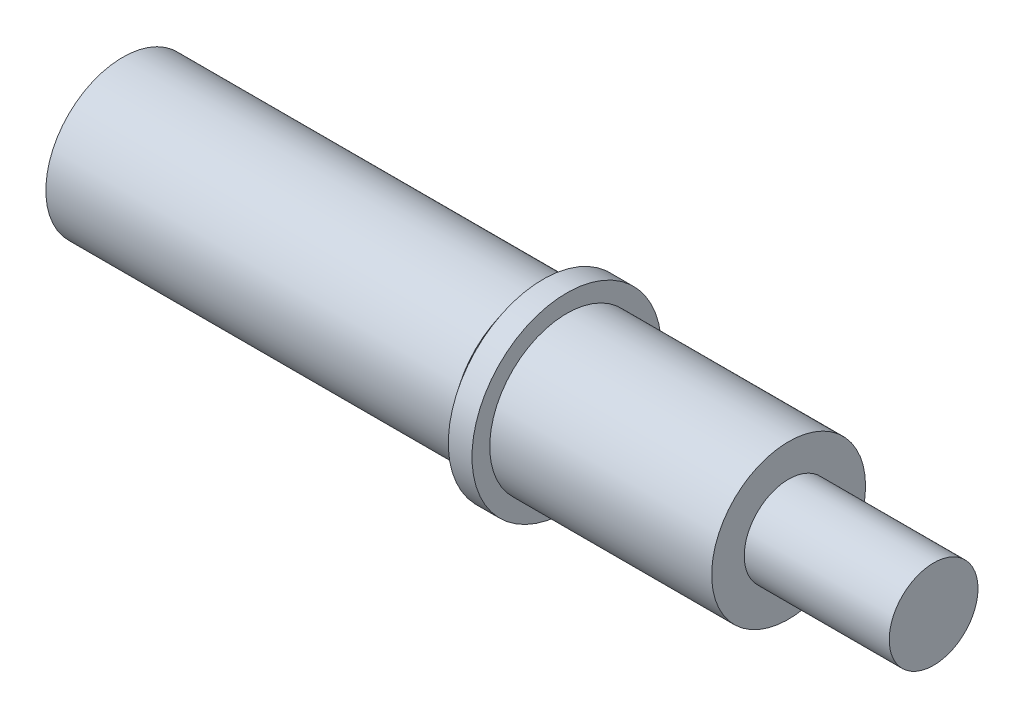
ISO-10303-21;
HEADER;
FILE_DESCRIPTION(('STEP AP214'),'2;1');
FILE_NAME('part.step','',(''),(''),'','','');
FILE_SCHEMA(('AUTOMOTIVE_DESIGN { 1 0 10303 214 1 1 1 1 }'));
ENDSEC;
DATA;
#1=APPLICATION_CONTEXT('core data for automotive mechanical design processes');
#2=APPLICATION_PROTOCOL_DEFINITION('international standard','automotive_design',2000,#1);
#3=PRODUCT_CONTEXT('',#1,'mechanical');
#4=PRODUCT('Part','Part','',(#3));
#5=PRODUCT_RELATED_PRODUCT_CATEGORY('part','',(#4));
#6=PRODUCT_DEFINITION_FORMATION('','',#4);
#7=PRODUCT_DEFINITION_CONTEXT('part definition',#1,'design');
#8=PRODUCT_DEFINITION('design','',#6,#7);
#9=PRODUCT_DEFINITION_SHAPE('','',#8);
#10=(LENGTH_UNIT() NAMED_UNIT(*) SI_UNIT(.MILLI.,.METRE.));
#11=(NAMED_UNIT(*) PLANE_ANGLE_UNIT() SI_UNIT($,.RADIAN.));
#12=(NAMED_UNIT(*) SI_UNIT($,.STERADIAN.) SOLID_ANGLE_UNIT());
#13=UNCERTAINTY_MEASURE_WITH_UNIT(LENGTH_MEASURE(1.E-05),#10,'distance_accuracy_value','');
#14=(GEOMETRIC_REPRESENTATION_CONTEXT(3) GLOBAL_UNCERTAINTY_ASSIGNED_CONTEXT((#13)) GLOBAL_UNIT_ASSIGNED_CONTEXT((#10,
#11,#12)) REPRESENTATION_CONTEXT('',''));
#15=CARTESIAN_POINT('',(0.,0.,0.));
#16=DIRECTION('',(0.,0.,1.));
#17=DIRECTION('',(1.,0.,0.));
#18=AXIS2_PLACEMENT_3D('',#15,#16,#17);
#19=CARTESIAN_POINT('',(137.5,0.,0.));
#20=DIRECTION('',(-1.,0.,0.));
#21=DIRECTION('',(0.,0.,1.));
#22=AXIS2_PLACEMENT_3D('',#19,#20,#21);
#23=CYLINDRICAL_SURFACE('',#22,26.);
#24=CARTESIAN_POINT('',(137.5,0.,0.));
#25=DIRECTION('',(1.,0.,0.));
#26=DIRECTION('',(0.,0.,-1.));
#27=AXIS2_PLACEMENT_3D('',#24,#25,#26);
#28=CIRCLE('',#27,26.);
#29=CARTESIAN_POINT('',(137.5,0.,-26.));
#30=VERTEX_POINT('',#29);
#31=EDGE_CURVE('E105',#30,#30,#28,.T.);
#32=ORIENTED_EDGE('',*,*,#31,.F.);
#33=EDGE_LOOP('',(#32));
#34=FACE_BOUND('',#33,.T.);
#35=CARTESIAN_POINT('',(0.,0.,0.));
#36=DIRECTION('',(1.,0.,0.));
#37=DIRECTION('',(0.,0.,-1.));
#38=AXIS2_PLACEMENT_3D('',#35,#36,#37);
#39=CIRCLE('',#38,26.);
#40=CARTESIAN_POINT('',(0.,0.,-26.));
#41=VERTEX_POINT('',#40);
#42=EDGE_CURVE('E56',#41,#41,#39,.T.);
#43=ORIENTED_EDGE('',*,*,#42,.T.);
#44=EDGE_LOOP('',(#43));
#45=FACE_BOUND('',#44,.T.);
#46=ADVANCED_FACE('F53',(#34,#45),#23,.T.);
#47=CARTESIAN_POINT('',(137.5,0.,0.));
#48=DIRECTION('',(1.,0.,0.));
#49=DIRECTION('',(0.,0.,-1.));
#50=AXIS2_PLACEMENT_3D('',#47,#48,#49);
#51=PLANE('',#50);
#52=CARTESIAN_POINT('',(137.5,0.,0.));
#53=DIRECTION('',(1.,0.,0.));
#54=DIRECTION('',(0.,0.,-1.));
#55=AXIS2_PLACEMENT_3D('',#52,#53,#54);
#56=CIRCLE('',#55,22.);
#57=CARTESIAN_POINT('',(137.5,0.,-22.));
#58=VERTEX_POINT('',#57);
#59=EDGE_CURVE('E91',#58,#58,#56,.T.);
#60=ORIENTED_EDGE('',*,*,#59,.F.);
#61=EDGE_LOOP('',(#60));
#62=FACE_BOUND('',#61,.T.);
#63=ORIENTED_EDGE('',*,*,#31,.T.);
#64=EDGE_LOOP('',(#63));
#65=FACE_BOUND('',#64,.T.);
#66=ADVANCED_FACE('F118',(#62,#65),#51,.T.);
#67=CARTESIAN_POINT('',(0.,0.,0.));
#68=DIRECTION('',(1.,0.,0.));
#69=DIRECTION('',(0.,0.,-1.));
#70=AXIS2_PLACEMENT_3D('',#67,#68,#69);
#71=PLANE('',#70);
#72=CARTESIAN_POINT('',(0.,0.,0.));
#73=DIRECTION('',(-1.,0.,0.));
#74=DIRECTION('',(0.,0.,1.));
#75=AXIS2_PLACEMENT_3D('',#72,#73,#74);
#76=CIRCLE('',#75,6.);
#77=CARTESIAN_POINT('',(0.,0.,6.));
#78=VERTEX_POINT('',#77);
#79=EDGE_CURVE('E77',#78,#78,#76,.T.);
#80=ORIENTED_EDGE('',*,*,#79,.F.);
#81=EDGE_LOOP('',(#80));
#82=FACE_BOUND('',#81,.T.);
#83=ORIENTED_EDGE('',*,*,#42,.F.);
#84=EDGE_LOOP('',(#83));
#85=FACE_BOUND('',#84,.T.);
#86=ADVANCED_FACE('F115',(#82,#85),#71,.F.);
#87=CARTESIAN_POINT('',(142.,0.,0.));
#88=DIRECTION('',(-1.,0.,0.));
#89=DIRECTION('',(0.,0.,1.));
#90=AXIS2_PLACEMENT_3D('',#87,#88,#89);
#91=CYLINDRICAL_SURFACE('',#90,22.);
#92=CARTESIAN_POINT('',(142.,0.,0.));
#93=DIRECTION('',(1.,0.,0.));
#94=DIRECTION('',(0.,0.,-1.));
#95=AXIS2_PLACEMENT_3D('',#92,#93,#94);
#96=CIRCLE('',#95,22.);
#97=CARTESIAN_POINT('',(142.,0.,-22.));
#98=VERTEX_POINT('',#97);
#99=EDGE_CURVE('E96',#98,#98,#96,.T.);
#100=ORIENTED_EDGE('',*,*,#99,.F.);
#101=EDGE_LOOP('',(#100));
#102=FACE_BOUND('',#101,.T.);
#103=ORIENTED_EDGE('',*,*,#59,.T.);
#104=EDGE_LOOP('',(#103));
#105=FACE_BOUND('',#104,.T.);
#106=ADVANCED_FACE('F117',(#102,#105),#91,.T.);
#107=CARTESIAN_POINT('',(150.,0.,0.));
#108=DIRECTION('',(-1.,0.,0.));
#109=DIRECTION('',(0.,0.,1.));
#110=AXIS2_PLACEMENT_3D('',#107,#108,#109);
#111=CYLINDRICAL_SURFACE('',#110,32.);
#112=CARTESIAN_POINT('',(150.,0.,0.));
#113=DIRECTION('',(1.,0.,0.));
#114=DIRECTION('',(0.,0.,-1.));
#115=AXIS2_PLACEMENT_3D('',#112,#113,#114);
#116=CIRCLE('',#115,32.);
#117=CARTESIAN_POINT('',(150.,0.,-32.));
#118=VERTEX_POINT('',#117);
#119=EDGE_CURVE('E92',#118,#118,#116,.T.);
#120=ORIENTED_EDGE('',*,*,#119,.F.);
#121=EDGE_LOOP('',(#120));
#122=FACE_BOUND('',#121,.T.);
#123=CARTESIAN_POINT('',(142.,0.,0.));
#124=DIRECTION('',(1.,0.,0.));
#125=DIRECTION('',(0.,0.,-1.));
#126=AXIS2_PLACEMENT_3D('',#123,#124,#125);
#127=CIRCLE('',#126,32.);
#128=CARTESIAN_POINT('',(142.,0.,-32.));
#129=VERTEX_POINT('',#128);
#130=EDGE_CURVE('E82',#129,#129,#127,.T.);
#131=ORIENTED_EDGE('',*,*,#130,.T.);
#132=EDGE_LOOP('',(#131));
#133=FACE_BOUND('',#132,.T.);
#134=ADVANCED_FACE('F125',(#122,#133),#111,.T.);
#135=CARTESIAN_POINT('',(150.,0.,0.));
#136=DIRECTION('',(1.,0.,0.));
#137=DIRECTION('',(0.,0.,-1.));
#138=AXIS2_PLACEMENT_3D('',#135,#136,#137);
#139=PLANE('',#138);
#140=CARTESIAN_POINT('',(150.,0.,0.));
#141=DIRECTION('',(1.,0.,0.));
#142=DIRECTION('',(0.,0.,-1.));
#143=AXIS2_PLACEMENT_3D('',#140,#141,#142);
#144=CIRCLE('',#143,26.);
#145=CARTESIAN_POINT('',(150.,0.,-26.));
#146=VERTEX_POINT('',#145);
#147=EDGE_CURVE('E61',#146,#146,#144,.T.);
#148=ORIENTED_EDGE('',*,*,#147,.F.);
#149=EDGE_LOOP('',(#148));
#150=FACE_BOUND('',#149,.T.);
#151=ORIENTED_EDGE('',*,*,#119,.T.);
#152=EDGE_LOOP('',(#151));
#153=FACE_BOUND('',#152,.T.);
#154=ADVANCED_FACE('F154',(#150,#153),#139,.T.);
#155=CARTESIAN_POINT('',(142.,0.,0.));
#156=DIRECTION('',(1.,0.,0.));
#157=DIRECTION('',(0.,0.,-1.));
#158=AXIS2_PLACEMENT_3D('',#155,#156,#157);
#159=PLANE('',#158);
#160=ORIENTED_EDGE('',*,*,#99,.T.);
#161=EDGE_LOOP('',(#160));
#162=FACE_BOUND('',#161,.T.);
#163=ORIENTED_EDGE('',*,*,#130,.F.);
#164=EDGE_LOOP('',(#163));
#165=FACE_BOUND('',#164,.T.);
#166=ADVANCED_FACE('F161',(#162,#165),#159,.F.);
#167=CARTESIAN_POINT('',(225.,0.,0.));
#168=DIRECTION('',(-1.,0.,0.));
#169=DIRECTION('',(0.,0.,1.));
#170=AXIS2_PLACEMENT_3D('',#167,#168,#169);
#171=CYLINDRICAL_SURFACE('',#170,26.);
#172=CARTESIAN_POINT('',(225.,0.,0.));
#173=DIRECTION('',(1.,0.,0.));
#174=DIRECTION('',(0.,0.,-1.));
#175=AXIS2_PLACEMENT_3D('',#172,#173,#174);
#176=CIRCLE('',#175,26.);
#177=CARTESIAN_POINT('',(225.,0.,-26.));
#178=VERTEX_POINT('',#177);
#179=EDGE_CURVE('E76',#178,#178,#176,.T.);
#180=ORIENTED_EDGE('',*,*,#179,.F.);
#181=EDGE_LOOP('',(#180));
#182=FACE_BOUND('',#181,.T.);
#183=ORIENTED_EDGE('',*,*,#147,.T.);
#184=EDGE_LOOP('',(#183));
#185=FACE_BOUND('',#184,.T.);
#186=ADVANCED_FACE('F165',(#182,#185),#171,.T.);
#187=CARTESIAN_POINT('',(225.,0.,0.));
#188=DIRECTION('',(1.,0.,0.));
#189=DIRECTION('',(0.,0.,-1.));
#190=AXIS2_PLACEMENT_3D('',#187,#188,#189);
#191=PLANE('',#190);
#192=CARTESIAN_POINT('',(225.,0.,0.));
#193=DIRECTION('',(1.,0.,0.));
#194=DIRECTION('',(0.,0.,-1.));
#195=AXIS2_PLACEMENT_3D('',#192,#193,#194);
#196=CIRCLE('',#195,15.);
#197=CARTESIAN_POINT('',(225.,0.,-15.));
#198=VERTEX_POINT('',#197);
#199=EDGE_CURVE('E11',#198,#198,#196,.T.);
#200=ORIENTED_EDGE('',*,*,#199,.F.);
#201=EDGE_LOOP('',(#200));
#202=FACE_BOUND('',#201,.T.);
#203=ORIENTED_EDGE('',*,*,#179,.T.);
#204=EDGE_LOOP('',(#203));
#205=FACE_BOUND('',#204,.T.);
#206=ADVANCED_FACE('F69',(#202,#205),#191,.T.);
#207=CARTESIAN_POINT('',(20.,0.,0.));
#208=DIRECTION('',(-1.,0.,0.));
#209=DIRECTION('',(0.,0.,1.));
#210=AXIS2_PLACEMENT_3D('',#207,#208,#209);
#211=CONICAL_SURFACE('',#210,5.99999999999999,1.02974425867665);
#212=CARTESIAN_POINT('',(23.6051637141654,0.,0.));
#213=VERTEX_POINT('',#212);
#214=VERTEX_LOOP('',#213);
#215=FACE_BOUND('',#214,.T.);
#216=CARTESIAN_POINT('',(20.,0.,0.));
#217=DIRECTION('',(-1.,0.,0.));
#218=DIRECTION('',(0.,0.,1.));
#219=AXIS2_PLACEMENT_3D('',#216,#217,#218);
#220=CIRCLE('',#219,5.99999999999999);
#221=CARTESIAN_POINT('',(20.,0.,5.99999999999999));
#222=VERTEX_POINT('',#221);
#223=EDGE_CURVE('E73',#222,#222,#220,.T.);
#224=ORIENTED_EDGE('',*,*,#223,.T.);
#225=EDGE_LOOP('',(#224));
#226=FACE_BOUND('',#225,.T.);
#227=ADVANCED_FACE('F65',(#215,#226),#211,.F.);
#228=CARTESIAN_POINT('',(0.,0.,0.));
#229=DIRECTION('',(-1.,0.,0.));
#230=DIRECTION('',(0.,0.,1.));
#231=AXIS2_PLACEMENT_3D('',#228,#229,#230);
#232=CYLINDRICAL_SURFACE('',#231,6.);
#233=ORIENTED_EDGE('',*,*,#223,.F.);
#234=EDGE_LOOP('',(#233));
#235=FACE_BOUND('',#234,.T.);
#236=ORIENTED_EDGE('',*,*,#79,.T.);
#237=EDGE_LOOP('',(#236));
#238=FACE_BOUND('',#237,.T.);
#239=ADVANCED_FACE('F68',(#235,#238),#232,.F.);
#240=CARTESIAN_POINT('',(274.,0.,0.));
#241=DIRECTION('',(-1.,0.,0.));
#242=DIRECTION('',(0.,0.,1.));
#243=AXIS2_PLACEMENT_3D('',#240,#241,#242);
#244=CYLINDRICAL_SURFACE('',#243,15.);
#245=CARTESIAN_POINT('',(274.,0.,0.));
#246=DIRECTION('',(1.,0.,0.));
#247=DIRECTION('',(0.,0.,-1.));
#248=AXIS2_PLACEMENT_3D('',#245,#246,#247);
#249=CIRCLE('',#248,15.);
#250=CARTESIAN_POINT('',(274.,0.,-15.));
#251=VERTEX_POINT('',#250);
#252=EDGE_CURVE('E85',#251,#251,#249,.T.);
#253=ORIENTED_EDGE('',*,*,#252,.F.);
#254=EDGE_LOOP('',(#253));
#255=FACE_BOUND('',#254,.T.);
#256=ORIENTED_EDGE('',*,*,#199,.T.);
#257=EDGE_LOOP('',(#256));
#258=FACE_BOUND('',#257,.T.);
#259=ADVANCED_FACE('F207',(#255,#258),#244,.T.);
#260=CARTESIAN_POINT('',(274.,0.,0.));
#261=DIRECTION('',(1.,0.,0.));
#262=DIRECTION('',(0.,0.,-1.));
#263=AXIS2_PLACEMENT_3D('',#260,#261,#262);
#264=PLANE('',#263);
#265=ORIENTED_EDGE('',*,*,#252,.T.);
#266=EDGE_LOOP('',(#265));
#267=FACE_BOUND('',#266,.T.);
#268=ADVANCED_FACE('F224',(#267),#264,.T.);
#269=CLOSED_SHELL('',(#46,#66,#86,#106,#134,#154,#166,#186,#206,#227,#239,#259,#268));
#270=MANIFOLD_SOLID_BREP('B2',#269);
#271=ADVANCED_BREP_SHAPE_REPRESENTATION('',(#18,#270),#14);
#272=SHAPE_DEFINITION_REPRESENTATION(#9,#271);
ENDSEC;
END-ISO-10303-21;
